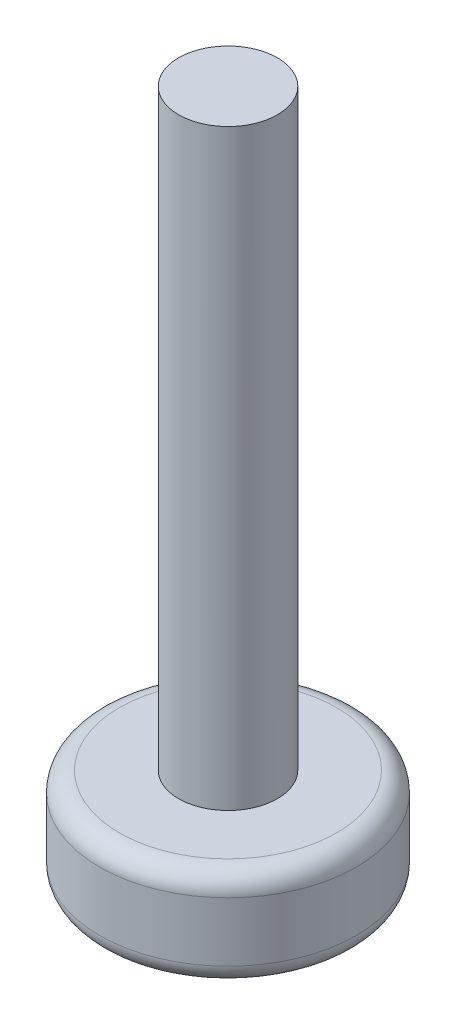
ISO-10303-21;
HEADER;
FILE_DESCRIPTION(('STEP AP214'),'2;1');
FILE_NAME('part.step','',(''),(''),'','','');
FILE_SCHEMA(('AUTOMOTIVE_DESIGN { 1 0 10303 214 1 1 1 1 }'));
ENDSEC;
DATA;
#1=APPLICATION_CONTEXT('core data for automotive mechanical design processes');
#2=APPLICATION_PROTOCOL_DEFINITION('international standard','automotive_design',2000,#1);
#3=PRODUCT_CONTEXT('',#1,'mechanical');
#4=PRODUCT('Part','Part','',(#3));
#5=PRODUCT_RELATED_PRODUCT_CATEGORY('part','',(#4));
#6=PRODUCT_DEFINITION_FORMATION('','',#4);
#7=PRODUCT_DEFINITION_CONTEXT('part definition',#1,'design');
#8=PRODUCT_DEFINITION('design','',#6,#7);
#9=PRODUCT_DEFINITION_SHAPE('','',#8);
#10=(LENGTH_UNIT() NAMED_UNIT(*) SI_UNIT(.MILLI.,.METRE.));
#11=(NAMED_UNIT(*) PLANE_ANGLE_UNIT() SI_UNIT($,.RADIAN.));
#12=(NAMED_UNIT(*) SI_UNIT($,.STERADIAN.) SOLID_ANGLE_UNIT());
#13=UNCERTAINTY_MEASURE_WITH_UNIT(LENGTH_MEASURE(1.E-05),#10,'distance_accuracy_value','');
#14=(GEOMETRIC_REPRESENTATION_CONTEXT(3) GLOBAL_UNCERTAINTY_ASSIGNED_CONTEXT((#13)) GLOBAL_UNIT_ASSIGNED_CONTEXT((#10,
#11,#12)) REPRESENTATION_CONTEXT('',''));
#15=CARTESIAN_POINT('',(0.,0.,0.));
#16=DIRECTION('',(0.,0.,1.));
#17=DIRECTION('',(1.,0.,0.));
#18=AXIS2_PLACEMENT_3D('',#15,#16,#17);
#19=CARTESIAN_POINT('',(0.,30.,0.));
#20=DIRECTION('',(0.,-1.,0.));
#21=DIRECTION('',(0.,0.,-1.));
#22=AXIS2_PLACEMENT_3D('',#19,#20,#21);
#23=CYLINDRICAL_SURFACE('',#22,2.5);
#24=CARTESIAN_POINT('',(0.,30.,0.));
#25=DIRECTION('',(0.,1.,0.));
#26=DIRECTION('',(0.,0.,1.));
#27=AXIS2_PLACEMENT_3D('',#24,#25,#26);
#28=CIRCLE('',#27,2.5);
#29=CARTESIAN_POINT('',(0.,30.,2.5));
#30=VERTEX_POINT('',#29);
#31=EDGE_CURVE('E10',#30,#30,#28,.T.);
#32=ORIENTED_EDGE('',*,*,#31,.F.);
#33=EDGE_LOOP('',(#32));
#34=FACE_BOUND('',#33,.T.);
#35=CARTESIAN_POINT('',(0.,0.,0.));
#36=DIRECTION('',(0.,1.,0.));
#37=DIRECTION('',(-1.,0.,0.));
#38=AXIS2_PLACEMENT_3D('',#35,#36,#37);
#39=CIRCLE('',#38,2.5);
#40=CARTESIAN_POINT('',(-2.5,0.,0.));
#41=VERTEX_POINT('',#40);
#42=EDGE_CURVE('E44',#41,#41,#39,.T.);
#43=ORIENTED_EDGE('',*,*,#42,.T.);
#44=EDGE_LOOP('',(#43));
#45=FACE_BOUND('',#44,.T.);
#46=ADVANCED_FACE('F38',(#34,#45),#23,.T.);
#47=CARTESIAN_POINT('',(0.,30.,0.));
#48=DIRECTION('',(0.,1.,0.));
#49=DIRECTION('',(0.,0.,1.));
#50=AXIS2_PLACEMENT_3D('',#47,#48,#49);
#51=PLANE('',#50);
#52=ORIENTED_EDGE('',*,*,#31,.T.);
#53=EDGE_LOOP('',(#52));
#54=FACE_BOUND('',#53,.T.);
#55=ADVANCED_FACE('F70',(#54),#51,.T.);
#56=CARTESIAN_POINT('',(0.,-4.,0.));
#57=DIRECTION('',(0.,1.,0.));
#58=DIRECTION('',(-1.,0.,0.));
#59=AXIS2_PLACEMENT_3D('',#56,#57,#58);
#60=TOROIDAL_SURFACE('',#59,5.5,1.);
#61=CARTESIAN_POINT('',(0.,-5.,0.));
#62=DIRECTION('',(0.,1.,0.));
#63=DIRECTION('',(-1.,0.,0.));
#64=AXIS2_PLACEMENT_3D('',#61,#62,#63);
#65=CIRCLE('',#64,5.5);
#66=CARTESIAN_POINT('',(-5.5,-5.,0.));
#67=VERTEX_POINT('',#66);
#68=EDGE_CURVE('E48',#67,#67,#65,.T.);
#69=ORIENTED_EDGE('',*,*,#68,.T.);
#70=EDGE_LOOP('',(#69));
#71=FACE_BOUND('',#70,.T.);
#72=CARTESIAN_POINT('',(0.,-4.,0.));
#73=DIRECTION('',(0.,1.,0.));
#74=DIRECTION('',(-1.,0.,0.));
#75=AXIS2_PLACEMENT_3D('',#72,#73,#74);
#76=CIRCLE('',#75,6.5);
#77=CARTESIAN_POINT('',(-6.5,-4.,0.));
#78=VERTEX_POINT('',#77);
#79=EDGE_CURVE('E60',#78,#78,#76,.T.);
#80=ORIENTED_EDGE('',*,*,#79,.F.);
#81=EDGE_LOOP('',(#80));
#82=FACE_BOUND('',#81,.T.);
#83=ADVANCED_FACE('F67',(#71,#82),#60,.T.);
#84=CARTESIAN_POINT('',(-5.5,-5.,0.));
#85=DIRECTION('',(0.,-1.,0.));
#86=DIRECTION('',(1.,0.,0.));
#87=AXIS2_PLACEMENT_3D('',#84,#85,#86);
#88=PLANE('',#87);
#89=ORIENTED_EDGE('',*,*,#68,.F.);
#90=EDGE_LOOP('',(#89));
#91=FACE_BOUND('',#90,.T.);
#92=ADVANCED_FACE('F69',(#91),#88,.T.);
#93=CARTESIAN_POINT('',(-5.5,0.,0.));
#94=DIRECTION('',(0.,1.,0.));
#95=DIRECTION('',(-1.,0.,0.));
#96=AXIS2_PLACEMENT_3D('',#93,#94,#95);
#97=PLANE('',#96);
#98=ORIENTED_EDGE('',*,*,#42,.F.);
#99=EDGE_LOOP('',(#98));
#100=FACE_BOUND('',#99,.T.);
#101=CARTESIAN_POINT('',(0.,0.,0.));
#102=DIRECTION('',(0.,1.,0.));
#103=DIRECTION('',(-1.,0.,0.));
#104=AXIS2_PLACEMENT_3D('',#101,#102,#103);
#105=CIRCLE('',#104,5.5);
#106=CARTESIAN_POINT('',(-5.5,0.,0.));
#107=VERTEX_POINT('',#106);
#108=EDGE_CURVE('E52',#107,#107,#105,.T.);
#109=ORIENTED_EDGE('',*,*,#108,.T.);
#110=EDGE_LOOP('',(#109));
#111=FACE_BOUND('',#110,.T.);
#112=ADVANCED_FACE('F77',(#100,#111),#97,.T.);
#113=CARTESIAN_POINT('',(0.,-0.999999999999999,0.));
#114=DIRECTION('',(0.,1.,0.));
#115=DIRECTION('',(-1.,0.,0.));
#116=AXIS2_PLACEMENT_3D('',#113,#114,#115);
#117=TOROIDAL_SURFACE('',#116,5.5,1.);
#118=CARTESIAN_POINT('',(0.,-0.999999999999999,0.));
#119=DIRECTION('',(0.,1.,0.));
#120=DIRECTION('',(-1.,0.,0.));
#121=AXIS2_PLACEMENT_3D('',#118,#119,#120);
#122=CIRCLE('',#121,6.5);
#123=CARTESIAN_POINT('',(-6.5,-1.,0.));
#124=VERTEX_POINT('',#123);
#125=EDGE_CURVE('E57',#124,#124,#122,.T.);
#126=ORIENTED_EDGE('',*,*,#125,.T.);
#127=EDGE_LOOP('',(#126));
#128=FACE_BOUND('',#127,.T.);
#129=ORIENTED_EDGE('',*,*,#108,.F.);
#130=EDGE_LOOP('',(#129));
#131=FACE_BOUND('',#130,.T.);
#132=ADVANCED_FACE('F117',(#128,#131),#117,.T.);
#133=CARTESIAN_POINT('',(0.,0.,0.));
#134=DIRECTION('',(0.,1.,0.));
#135=DIRECTION('',(-1.,0.,0.));
#136=AXIS2_PLACEMENT_3D('',#133,#134,#135);
#137=CYLINDRICAL_SURFACE('',#136,6.5);
#138=ORIENTED_EDGE('',*,*,#79,.T.);
#139=EDGE_LOOP('',(#138));
#140=FACE_BOUND('',#139,.T.);
#141=ORIENTED_EDGE('',*,*,#125,.F.);
#142=EDGE_LOOP('',(#141));
#143=FACE_BOUND('',#142,.T.);
#144=ADVANCED_FACE('F64',(#140,#143),#137,.T.);
#145=CLOSED_SHELL('',(#46,#55,#83,#92,#112,#132,#144));
#146=MANIFOLD_SOLID_BREP('B2',#145);
#147=ADVANCED_BREP_SHAPE_REPRESENTATION('',(#18,#146),#14);
#148=SHAPE_DEFINITION_REPRESENTATION(#9,#147);
ENDSEC;
END-ISO-10303-21;
